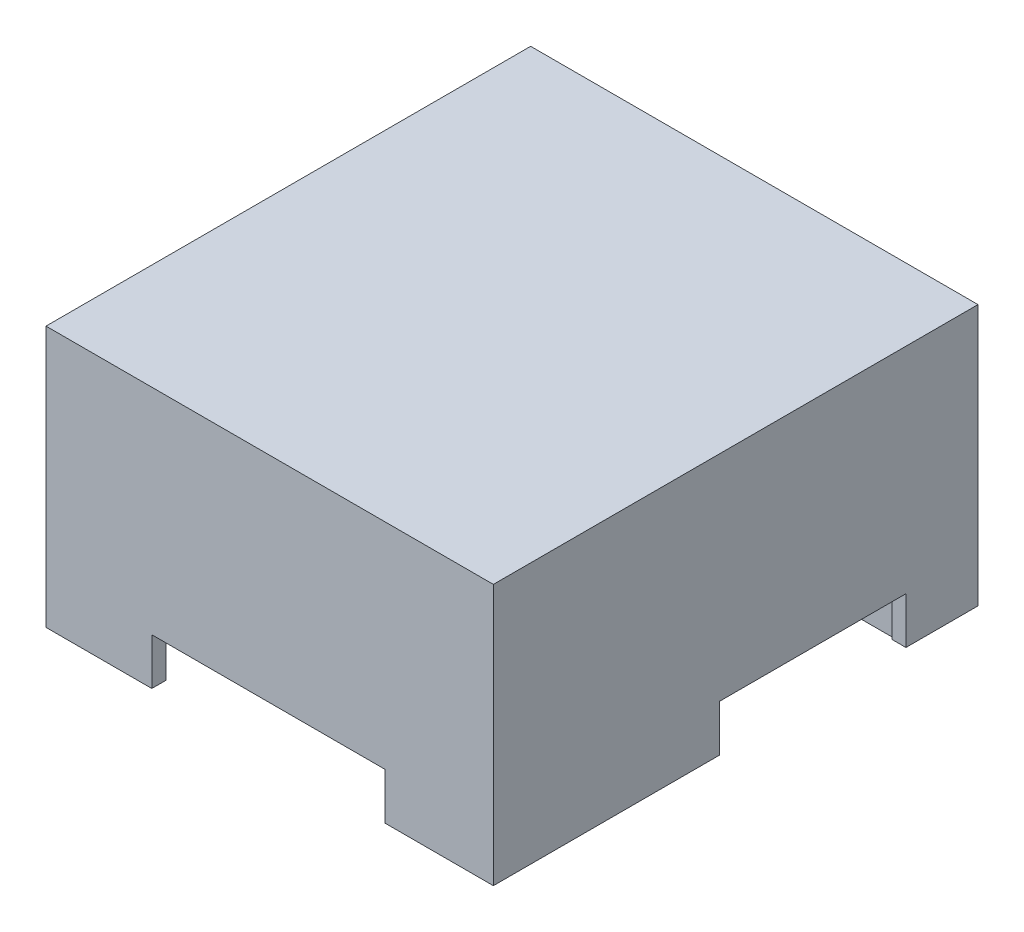
ISO-10303-21;
HEADER;
FILE_DESCRIPTION(('STEP AP214'),'2;1');
FILE_NAME('part.step','',(''),(''),'','','');
FILE_SCHEMA(('AUTOMOTIVE_DESIGN { 1 0 10303 214 1 1 1 1 }'));
ENDSEC;
DATA;
#1=APPLICATION_CONTEXT('core data for automotive mechanical design processes');
#2=APPLICATION_PROTOCOL_DEFINITION('international standard','automotive_design',2000,#1);
#3=PRODUCT_CONTEXT('',#1,'mechanical');
#4=PRODUCT('Part','Part','',(#3));
#5=PRODUCT_RELATED_PRODUCT_CATEGORY('part','',(#4));
#6=PRODUCT_DEFINITION_FORMATION('','',#4);
#7=PRODUCT_DEFINITION_CONTEXT('part definition',#1,'design');
#8=PRODUCT_DEFINITION('design','',#6,#7);
#9=PRODUCT_DEFINITION_SHAPE('','',#8);
#10=(LENGTH_UNIT() NAMED_UNIT(*) SI_UNIT(.MILLI.,.METRE.));
#11=(NAMED_UNIT(*) PLANE_ANGLE_UNIT() SI_UNIT($,.RADIAN.));
#12=(NAMED_UNIT(*) SI_UNIT($,.STERADIAN.) SOLID_ANGLE_UNIT());
#13=UNCERTAINTY_MEASURE_WITH_UNIT(LENGTH_MEASURE(1.E-05),#10,'distance_accuracy_value','');
#14=(GEOMETRIC_REPRESENTATION_CONTEXT(3) GLOBAL_UNCERTAINTY_ASSIGNED_CONTEXT((#13)) GLOBAL_UNIT_ASSIGNED_CONTEXT((#10,
#11,#12)) REPRESENTATION_CONTEXT('',''));
#15=CARTESIAN_POINT('',(0.,0.,0.));
#16=DIRECTION('',(0.,0.,1.));
#17=DIRECTION('',(1.,0.,0.));
#18=AXIS2_PLACEMENT_3D('',#15,#16,#17);
#19=CARTESIAN_POINT('',(0.,0.,0.));
#20=DIRECTION('',(0.,-1.,0.));
#21=DIRECTION('',(0.,0.,-1.));
#22=AXIS2_PLACEMENT_3D('',#19,#20,#21);
#23=PLANE('',#22);
#24=CARTESIAN_POINT('',(-18.75,0.,-20.6237708175574));
#25=DIRECTION('',(0.,1.,0.));
#26=DIRECTION('',(0.,0.,1.));
#27=AXIS2_PLACEMENT_3D('',#24,#25,#26);
#28=CIRCLE('',#27,1.);
#29=CARTESIAN_POINT('',(-18.75,0.,-19.6237708175574));
#30=VERTEX_POINT('',#29);
#31=EDGE_CURVE('E390',#30,#30,#28,.T.);
#32=ORIENTED_EDGE('',*,*,#31,.T.);
#33=EDGE_LOOP('',(#32));
#34=FACE_BOUND('',#33,.T.);
#35=CARTESIAN_POINT('',(18.75,0.,-20.6237708175574));
#36=DIRECTION('',(0.,1.,0.));
#37=DIRECTION('',(0.,0.,-1.));
#38=AXIS2_PLACEMENT_3D('',#35,#36,#37);
#39=CIRCLE('',#38,1.);
#40=CARTESIAN_POINT('',(18.75,0.,-21.6237708175574));
#41=VERTEX_POINT('',#40);
#42=EDGE_CURVE('E386',#41,#41,#39,.T.);
#43=ORIENTED_EDGE('',*,*,#42,.T.);
#44=EDGE_LOOP('',(#43));
#45=FACE_BOUND('',#44,.T.);
#46=DIRECTION('',(0.,0.,1.));
#47=VECTOR('',#46,1.);
#48=CARTESIAN_POINT('',(-22.5,0.,-24.5));
#49=LINE('',#48,#47);
#50=CARTESIAN_POINT('',(-22.5,0.,-18.5));
#51=VERTEX_POINT('',#50);
#52=CARTESIAN_POINT('',(-22.5,0.,-1.81575823975167));
#53=VERTEX_POINT('',#52);
#54=EDGE_CURVE('E559',#51,#53,#49,.T.);
#55=ORIENTED_EDGE('',*,*,#54,.T.);
#56=DIRECTION('',(-1.,0.,0.));
#57=VECTOR('',#56,1.);
#58=CARTESIAN_POINT('',(-21.,0.,-1.81575823975167));
#59=LINE('',#58,#57);
#60=CARTESIAN_POINT('',(-24.,0.,-1.81575823975167));
#61=VERTEX_POINT('',#60);
#62=EDGE_CURVE('E285',#53,#61,#59,.T.);
#63=ORIENTED_EDGE('',*,*,#62,.T.);
#64=DIRECTION('',(0.,0.,1.));
#65=VECTOR('',#64,1.);
#66=CARTESIAN_POINT('',(-24.,0.,-26.));
#67=LINE('',#66,#65);
#68=CARTESIAN_POINT('',(-24.,0.,-26.));
#69=VERTEX_POINT('',#68);
#70=EDGE_CURVE('E591',#69,#61,#67,.T.);
#71=ORIENTED_EDGE('',*,*,#70,.F.);
#72=DIRECTION('',(-1.,0.,0.));
#73=VECTOR('',#72,1.);
#74=CARTESIAN_POINT('',(24.,0.,-26.));
#75=LINE('',#74,#73);
#76=CARTESIAN_POINT('',(24.,0.,-26.));
#77=VERTEX_POINT('',#76);
#78=EDGE_CURVE('E604',#77,#69,#75,.T.);
#79=ORIENTED_EDGE('',*,*,#78,.F.);
#80=DIRECTION('',(0.,0.,-1.));
#81=VECTOR('',#80,1.);
#82=CARTESIAN_POINT('',(24.,0.,-26.));
#83=LINE('',#82,#81);
#84=CARTESIAN_POINT('',(24.,0.,-18.2667762256916));
#85=VERTEX_POINT('',#84);
#86=EDGE_CURVE('E599',#85,#77,#83,.T.);
#87=ORIENTED_EDGE('',*,*,#86,.F.);
#88=DIRECTION('',(1.,0.,0.));
#89=VECTOR('',#88,1.);
#90=CARTESIAN_POINT('',(21.,0.,-18.2667762256916));
#91=LINE('',#90,#89);
#92=CARTESIAN_POINT('',(22.5,0.,-18.2667762256916));
#93=VERTEX_POINT('',#92);
#94=EDGE_CURVE('E314',#93,#85,#91,.T.);
#95=ORIENTED_EDGE('',*,*,#94,.F.);
#96=DIRECTION('',(0.,0.,-1.));
#97=VECTOR('',#96,1.);
#98=CARTESIAN_POINT('',(22.5,0.,-24.5));
#99=LINE('',#98,#97);
#100=CARTESIAN_POINT('',(22.5,0.,-18.5));
#101=VERTEX_POINT('',#100);
#102=EDGE_CURVE('E568',#93,#101,#99,.T.);
#103=ORIENTED_EDGE('',*,*,#102,.T.);
#104=DIRECTION('',(1.,0.,0.));
#105=VECTOR('',#104,1.);
#106=CARTESIAN_POINT('',(22.5,0.,-18.5));
#107=LINE('',#106,#105);
#108=CARTESIAN_POINT('',(16.5,0.,-18.5));
#109=VERTEX_POINT('',#108);
#110=EDGE_CURVE('E490',#109,#101,#107,.T.);
#111=ORIENTED_EDGE('',*,*,#110,.F.);
#112=DIRECTION('',(0.,0.,1.));
#113=VECTOR('',#112,1.);
#114=CARTESIAN_POINT('',(16.5,0.,-24.5));
#115=LINE('',#114,#113);
#116=CARTESIAN_POINT('',(16.5,0.,-24.5));
#117=VERTEX_POINT('',#116);
#118=EDGE_CURVE('E494',#117,#109,#115,.T.);
#119=ORIENTED_EDGE('',*,*,#118,.F.);
#120=DIRECTION('',(-1.,0.,0.));
#121=VECTOR('',#120,1.);
#122=CARTESIAN_POINT('',(22.5,0.,-24.5));
#123=LINE('',#122,#121);
#124=CARTESIAN_POINT('',(-16.5,0.,-24.5));
#125=VERTEX_POINT('',#124);
#126=EDGE_CURVE('E546',#117,#125,#123,.T.);
#127=ORIENTED_EDGE('',*,*,#126,.T.);
#128=DIRECTION('',(0.,0.,-1.));
#129=VECTOR('',#128,1.);
#130=CARTESIAN_POINT('',(-16.5,0.,-24.5));
#131=LINE('',#130,#129);
#132=CARTESIAN_POINT('',(-16.5,0.,-18.5));
#133=VERTEX_POINT('',#132);
#134=EDGE_CURVE('E514',#133,#125,#131,.T.);
#135=ORIENTED_EDGE('',*,*,#134,.F.);
#136=DIRECTION('',(1.,0.,0.));
#137=VECTOR('',#136,1.);
#138=CARTESIAN_POINT('',(-22.5,0.,-18.5));
#139=LINE('',#138,#137);
#140=EDGE_CURVE('E498',#51,#133,#139,.T.);
#141=ORIENTED_EDGE('',*,*,#140,.F.);
#142=EDGE_LOOP('',(#55,#63,#71,#79,#87,#95,#103,#111,#119,#127,#135,#141));
#143=FACE_BOUND('',#142,.T.);
#144=ADVANCED_FACE('F45',(#34,#45,#143),#23,.T.);
#145=CARTESIAN_POINT('',(18.75,0.,20.8762291824426));
#146=DIRECTION('',(0.,1.,0.));
#147=DIRECTION('',(0.,0.,1.));
#148=AXIS2_PLACEMENT_3D('',#145,#146,#147);
#149=CIRCLE('',#148,1.);
#150=CARTESIAN_POINT('',(18.75,0.,21.8762291824426));
#151=VERTEX_POINT('',#150);
#152=EDGE_CURVE('E395',#151,#151,#149,.T.);
#153=ORIENTED_EDGE('',*,*,#152,.T.);
#154=EDGE_LOOP('',(#153));
#155=FACE_BOUND('',#154,.T.);
#156=CARTESIAN_POINT('',(22.5,0.,18.5));
#157=VERTEX_POINT('',#156);
#158=CARTESIAN_POINT('',(22.5,0.,1.73322377430841));
#159=VERTEX_POINT('',#158);
#160=EDGE_CURVE('E569',#157,#159,#99,.T.);
#161=ORIENTED_EDGE('',*,*,#160,.T.);
#162=DIRECTION('',(1.,0.,0.));
#163=VECTOR('',#162,1.);
#164=CARTESIAN_POINT('',(21.,0.,1.73322377430841));
#165=LINE('',#164,#163);
#166=CARTESIAN_POINT('',(24.,0.,1.73322377430841));
#167=VERTEX_POINT('',#166);
#168=EDGE_CURVE('E317',#159,#167,#165,.T.);
#169=ORIENTED_EDGE('',*,*,#168,.T.);
#170=CARTESIAN_POINT('',(24.,0.,26.));
#171=VERTEX_POINT('',#170);
#172=EDGE_CURVE('E600',#171,#167,#83,.T.);
#173=ORIENTED_EDGE('',*,*,#172,.F.);
#174=DIRECTION('',(1.,0.,0.));
#175=VECTOR('',#174,1.);
#176=CARTESIAN_POINT('',(24.,0.,26.));
#177=LINE('',#176,#175);
#178=CARTESIAN_POINT('',(12.3513897517003,0.,26.));
#179=VERTEX_POINT('',#178);
#180=EDGE_CURVE('E594',#179,#171,#177,.T.);
#181=ORIENTED_EDGE('',*,*,#180,.F.);
#182=DIRECTION('',(0.,0.,1.));
#183=VECTOR('',#182,1.);
#184=CARTESIAN_POINT('',(12.3513897517003,0.,23.));
#185=LINE('',#184,#183);
#186=CARTESIAN_POINT('',(12.3513897517003,0.,24.5));
#187=VERTEX_POINT('',#186);
#188=EDGE_CURVE('E352',#187,#179,#185,.T.);
#189=ORIENTED_EDGE('',*,*,#188,.F.);
#190=DIRECTION('',(1.,0.,0.));
#191=VECTOR('',#190,1.);
#192=CARTESIAN_POINT('',(22.5,0.,24.5));
#193=LINE('',#192,#191);
#194=CARTESIAN_POINT('',(16.5,0.,24.5));
#195=VERTEX_POINT('',#194);
#196=EDGE_CURVE('E563',#187,#195,#193,.T.);
#197=ORIENTED_EDGE('',*,*,#196,.T.);
#198=DIRECTION('',(0.,0.,1.));
#199=VECTOR('',#198,1.);
#200=CARTESIAN_POINT('',(16.5,0.,24.5));
#201=LINE('',#200,#199);
#202=CARTESIAN_POINT('',(16.5,0.,18.5));
#203=VERTEX_POINT('',#202);
#204=EDGE_CURVE('E460',#203,#195,#201,.T.);
#205=ORIENTED_EDGE('',*,*,#204,.F.);
#206=DIRECTION('',(-1.,0.,0.));
#207=VECTOR('',#206,1.);
#208=CARTESIAN_POINT('',(22.5,0.,18.5));
#209=LINE('',#208,#207);
#210=EDGE_CURVE('E464',#157,#203,#209,.T.);
#211=ORIENTED_EDGE('',*,*,#210,.F.);
#212=EDGE_LOOP('',(#161,#169,#173,#181,#189,#197,#205,#211));
#213=FACE_BOUND('',#212,.T.);
#214=ADVANCED_FACE('F624',(#155,#213),#23,.T.);
#215=CARTESIAN_POINT('',(22.5,25.,24.5));
#216=DIRECTION('',(0.,0.,-1.));
#217=DIRECTION('',(-1.,0.,0.));
#218=AXIS2_PLACEMENT_3D('',#215,#216,#217);
#219=PLANE('',#218);
#220=DIRECTION('',(0.,-1.,0.));
#221=VECTOR('',#220,1.);
#222=CARTESIAN_POINT('',(12.3513897517003,25.,24.5));
#223=LINE('',#222,#221);
#224=CARTESIAN_POINT('',(12.3513897517003,5.,24.5));
#225=VERTEX_POINT('',#224);
#226=EDGE_CURVE('E362',#225,#187,#223,.T.);
#227=ORIENTED_EDGE('',*,*,#226,.F.);
#228=DIRECTION('',(-1.,0.,0.));
#229=VECTOR('',#228,1.);
#230=CARTESIAN_POINT('',(22.5,5.,24.5));
#231=LINE('',#230,#229);
#232=CARTESIAN_POINT('',(-12.6486102482997,5.,24.5));
#233=VERTEX_POINT('',#232);
#234=EDGE_CURVE('E365',#225,#233,#231,.T.);
#235=ORIENTED_EDGE('',*,*,#234,.T.);
#236=DIRECTION('',(0.,-1.,0.));
#237=VECTOR('',#236,1.);
#238=CARTESIAN_POINT('',(-12.6486102482997,25.,24.5));
#239=LINE('',#238,#237);
#240=CARTESIAN_POINT('',(-12.6486102482997,0.,24.5));
#241=VERTEX_POINT('',#240);
#242=EDGE_CURVE('E358',#233,#241,#239,.T.);
#243=ORIENTED_EDGE('',*,*,#242,.T.);
#244=CARTESIAN_POINT('',(-16.5,0.,24.5));
#245=VERTEX_POINT('',#244);
#246=EDGE_CURVE('E564',#245,#241,#193,.T.);
#247=ORIENTED_EDGE('',*,*,#246,.F.);
#248=DIRECTION('',(0.,-1.,0.));
#249=VECTOR('',#248,1.);
#250=CARTESIAN_POINT('',(-16.5,15.,24.5));
#251=LINE('',#250,#249);
#252=CARTESIAN_POINT('',(-16.5,15.,24.5));
#253=VERTEX_POINT('',#252);
#254=EDGE_CURVE('E414',#253,#245,#251,.T.);
#255=ORIENTED_EDGE('',*,*,#254,.F.);
#256=DIRECTION('',(1.,0.,0.));
#257=VECTOR('',#256,1.);
#258=CARTESIAN_POINT('',(-22.5,15.,24.5));
#259=LINE('',#258,#257);
#260=CARTESIAN_POINT('',(-22.5,15.,24.5));
#261=VERTEX_POINT('',#260);
#262=EDGE_CURVE('E444',#261,#253,#259,.T.);
#263=ORIENTED_EDGE('',*,*,#262,.F.);
#264=DIRECTION('',(0.,-1.,0.));
#265=VECTOR('',#264,1.);
#266=CARTESIAN_POINT('',(-22.5,25.,24.5));
#267=LINE('',#266,#265);
#268=CARTESIAN_POINT('',(-22.5,25.,24.5));
#269=VERTEX_POINT('',#268);
#270=EDGE_CURVE('E586',#269,#261,#267,.T.);
#271=ORIENTED_EDGE('',*,*,#270,.F.);
#272=DIRECTION('',(1.,0.,0.));
#273=VECTOR('',#272,1.);
#274=CARTESIAN_POINT('',(22.5,25.,24.5));
#275=LINE('',#274,#273);
#276=CARTESIAN_POINT('',(22.5,25.,24.5));
#277=VERTEX_POINT('',#276);
#278=EDGE_CURVE('E545',#269,#277,#275,.T.);
#279=ORIENTED_EDGE('',*,*,#278,.T.);
#280=DIRECTION('',(0.,-1.,0.));
#281=VECTOR('',#280,1.);
#282=CARTESIAN_POINT('',(22.5,25.,24.5));
#283=LINE('',#282,#281);
#284=CARTESIAN_POINT('',(22.5,15.,24.5));
#285=VERTEX_POINT('',#284);
#286=EDGE_CURVE('E582',#277,#285,#283,.T.);
#287=ORIENTED_EDGE('',*,*,#286,.T.);
#288=DIRECTION('',(1.,0.,0.));
#289=VECTOR('',#288,1.);
#290=CARTESIAN_POINT('',(22.5,15.,24.5));
#291=LINE('',#290,#289);
#292=CARTESIAN_POINT('',(16.5,15.,24.5));
#293=VERTEX_POINT('',#292);
#294=EDGE_CURVE('E465',#293,#285,#291,.T.);
#295=ORIENTED_EDGE('',*,*,#294,.F.);
#296=DIRECTION('',(0.,-1.,0.));
#297=VECTOR('',#296,1.);
#298=CARTESIAN_POINT('',(16.5,15.,24.5));
#299=LINE('',#298,#297);
#300=EDGE_CURVE('E455',#293,#195,#299,.T.);
#301=ORIENTED_EDGE('',*,*,#300,.T.);
#302=ORIENTED_EDGE('',*,*,#196,.F.);
#303=EDGE_LOOP('',(#227,#235,#243,#247,#255,#263,#271,#279,#287,#295,#301,#302));
#304=FACE_BOUND('',#303,.T.);
#305=ADVANCED_FACE('F673',(#304),#219,.T.);
#306=CARTESIAN_POINT('',(-22.5,25.,-24.5));
#307=DIRECTION('',(1.,0.,0.));
#308=DIRECTION('',(0.,0.,-1.));
#309=AXIS2_PLACEMENT_3D('',#306,#307,#308);
#310=PLANE('',#309);
#311=DIRECTION('',(0.,-1.,0.));
#312=VECTOR('',#311,1.);
#313=CARTESIAN_POINT('',(-22.5,25.,18.1842417602483));
#314=LINE('',#313,#312);
#315=CARTESIAN_POINT('',(-22.5,5.,18.1842417602483));
#316=VERTEX_POINT('',#315);
#317=CARTESIAN_POINT('',(-22.5,0.,18.1842417602483));
#318=VERTEX_POINT('',#317);
#319=EDGE_CURVE('E294',#316,#318,#314,.T.);
#320=ORIENTED_EDGE('',*,*,#319,.F.);
#321=DIRECTION('',(0.,0.,-1.));
#322=VECTOR('',#321,1.);
#323=CARTESIAN_POINT('',(-22.5,5.,-24.5));
#324=LINE('',#323,#322);
#325=CARTESIAN_POINT('',(-22.5,5.,-1.81575823975167));
#326=VERTEX_POINT('',#325);
#327=EDGE_CURVE('E259',#316,#326,#324,.T.);
#328=ORIENTED_EDGE('',*,*,#327,.T.);
#329=DIRECTION('',(0.,-1.,0.));
#330=VECTOR('',#329,1.);
#331=CARTESIAN_POINT('',(-22.5,25.,-1.81575823975167));
#332=LINE('',#331,#330);
#333=EDGE_CURVE('E263',#326,#53,#332,.T.);
#334=ORIENTED_EDGE('',*,*,#333,.T.);
#335=ORIENTED_EDGE('',*,*,#54,.F.);
#336=DIRECTION('',(0.,-1.,0.));
#337=VECTOR('',#336,1.);
#338=CARTESIAN_POINT('',(-22.5,15.,-18.5));
#339=LINE('',#338,#337);
#340=CARTESIAN_POINT('',(-22.5,15.,-18.5));
#341=VERTEX_POINT('',#340);
#342=EDGE_CURVE('E536',#341,#51,#339,.T.);
#343=ORIENTED_EDGE('',*,*,#342,.F.);
#344=DIRECTION('',(0.,0.,1.));
#345=VECTOR('',#344,1.);
#346=CARTESIAN_POINT('',(-22.5,15.,-24.5));
#347=LINE('',#346,#345);
#348=CARTESIAN_POINT('',(-22.5,15.,-24.5));
#349=VERTEX_POINT('',#348);
#350=EDGE_CURVE('E509',#349,#341,#347,.T.);
#351=ORIENTED_EDGE('',*,*,#350,.F.);
#352=DIRECTION('',(0.,-1.,0.));
#353=VECTOR('',#352,1.);
#354=CARTESIAN_POINT('',(-22.5,25.,-24.5));
#355=LINE('',#354,#353);
#356=CARTESIAN_POINT('',(-22.5,25.,-24.5));
#357=VERTEX_POINT('',#356);
#358=EDGE_CURVE('E558',#357,#349,#355,.T.);
#359=ORIENTED_EDGE('',*,*,#358,.F.);
#360=DIRECTION('',(0.,0.,1.));
#361=VECTOR('',#360,1.);
#362=CARTESIAN_POINT('',(-22.5,25.,-24.5));
#363=LINE('',#362,#361);
#364=EDGE_CURVE('E541',#357,#269,#363,.T.);
#365=ORIENTED_EDGE('',*,*,#364,.T.);
#366=ORIENTED_EDGE('',*,*,#270,.T.);
#367=DIRECTION('',(0.,0.,1.));
#368=VECTOR('',#367,1.);
#369=CARTESIAN_POINT('',(-22.5,15.,24.5));
#370=LINE('',#369,#368);
#371=CARTESIAN_POINT('',(-22.5,15.,18.5));
#372=VERTEX_POINT('',#371);
#373=EDGE_CURVE('E435',#372,#261,#370,.T.);
#374=ORIENTED_EDGE('',*,*,#373,.F.);
#375=DIRECTION('',(0.,-1.,0.));
#376=VECTOR('',#375,1.);
#377=CARTESIAN_POINT('',(-22.5,15.,18.5));
#378=LINE('',#377,#376);
#379=CARTESIAN_POINT('',(-22.5,0.,18.5));
#380=VERTEX_POINT('',#379);
#381=EDGE_CURVE('E425',#372,#380,#378,.T.);
#382=ORIENTED_EDGE('',*,*,#381,.T.);
#383=EDGE_CURVE('E540',#318,#380,#49,.T.);
#384=ORIENTED_EDGE('',*,*,#383,.F.);
#385=EDGE_LOOP('',(#320,#328,#334,#335,#343,#351,#359,#365,#366,#374,#382,#384));
#386=FACE_BOUND('',#385,.T.);
#387=ADVANCED_FACE('F664',(#386),#310,.T.);
#388=CARTESIAN_POINT('',(22.5,25.,-24.5));
#389=DIRECTION('',(-1.,0.,0.));
#390=DIRECTION('',(0.,0.,1.));
#391=AXIS2_PLACEMENT_3D('',#388,#389,#390);
#392=PLANE('',#391);
#393=DIRECTION('',(0.,-1.,0.));
#394=VECTOR('',#393,1.);
#395=CARTESIAN_POINT('',(22.5,25.,-18.2667762256916));
#396=LINE('',#395,#394);
#397=CARTESIAN_POINT('',(22.5,5.,-18.2667762256916));
#398=VERTEX_POINT('',#397);
#399=EDGE_CURVE('E326',#398,#93,#396,.T.);
#400=ORIENTED_EDGE('',*,*,#399,.F.);
#401=DIRECTION('',(0.,0.,-1.));
#402=VECTOR('',#401,1.);
#403=CARTESIAN_POINT('',(22.5,5.,-24.5));
#404=LINE('',#403,#402);
#405=CARTESIAN_POINT('',(22.5,5.,1.73322377430841));
#406=VERTEX_POINT('',#405);
#407=EDGE_CURVE('E329',#406,#398,#404,.T.);
#408=ORIENTED_EDGE('',*,*,#407,.F.);
#409=DIRECTION('',(0.,-1.,0.));
#410=VECTOR('',#409,1.);
#411=CARTESIAN_POINT('',(22.5,25.,1.73322377430841));
#412=LINE('',#411,#410);
#413=EDGE_CURVE('E313',#406,#159,#412,.T.);
#414=ORIENTED_EDGE('',*,*,#413,.T.);
#415=ORIENTED_EDGE('',*,*,#160,.F.);
#416=DIRECTION('',(0.,-1.,0.));
#417=VECTOR('',#416,1.);
#418=CARTESIAN_POINT('',(22.5,15.,18.5));
#419=LINE('',#418,#417);
#420=CARTESIAN_POINT('',(22.5,15.,18.5));
#421=VERTEX_POINT('',#420);
#422=EDGE_CURVE('E438',#421,#157,#419,.T.);
#423=ORIENTED_EDGE('',*,*,#422,.F.);
#424=DIRECTION('',(0.,0.,-1.));
#425=VECTOR('',#424,1.);
#426=CARTESIAN_POINT('',(22.5,15.,24.5));
#427=LINE('',#426,#425);
#428=EDGE_CURVE('E474',#285,#421,#427,.T.);
#429=ORIENTED_EDGE('',*,*,#428,.F.);
#430=ORIENTED_EDGE('',*,*,#286,.F.);
#431=DIRECTION('',(0.,0.,-1.));
#432=VECTOR('',#431,1.);
#433=CARTESIAN_POINT('',(22.5,25.,-24.5));
#434=LINE('',#433,#432);
#435=CARTESIAN_POINT('',(22.5,25.,-24.5));
#436=VERTEX_POINT('',#435);
#437=EDGE_CURVE('E550',#277,#436,#434,.T.);
#438=ORIENTED_EDGE('',*,*,#437,.T.);
#439=DIRECTION('',(0.,-1.,0.));
#440=VECTOR('',#439,1.);
#441=CARTESIAN_POINT('',(22.5,25.,-24.5));
#442=LINE('',#441,#440);
#443=CARTESIAN_POINT('',(22.5,15.,-24.5));
#444=VERTEX_POINT('',#443);
#445=EDGE_CURVE('E578',#436,#444,#442,.T.);
#446=ORIENTED_EDGE('',*,*,#445,.T.);
#447=DIRECTION('',(0.,0.,-1.));
#448=VECTOR('',#447,1.);
#449=CARTESIAN_POINT('',(22.5,15.,-24.5));
#450=LINE('',#449,#448);
#451=CARTESIAN_POINT('',(22.5,15.,-18.5));
#452=VERTEX_POINT('',#451);
#453=EDGE_CURVE('E495',#452,#444,#450,.T.);
#454=ORIENTED_EDGE('',*,*,#453,.F.);
#455=DIRECTION('',(0.,-1.,0.));
#456=VECTOR('',#455,1.);
#457=CARTESIAN_POINT('',(22.5,15.,-18.5));
#458=LINE('',#457,#456);
#459=EDGE_CURVE('E485',#452,#101,#458,.T.);
#460=ORIENTED_EDGE('',*,*,#459,.T.);
#461=ORIENTED_EDGE('',*,*,#102,.F.);
#462=EDGE_LOOP('',(#400,#408,#414,#415,#423,#429,#430,#438,#446,#454,#460,#461));
#463=FACE_BOUND('',#462,.T.);
#464=ADVANCED_FACE('F633',(#463),#392,.T.);
#465=CARTESIAN_POINT('',(22.5,25.,-24.5));
#466=DIRECTION('',(0.,0.,1.));
#467=DIRECTION('',(1.,0.,0.));
#468=AXIS2_PLACEMENT_3D('',#465,#466,#467);
#469=PLANE('',#468);
#470=ORIENTED_EDGE('',*,*,#126,.F.);
#471=DIRECTION('',(0.,-1.,0.));
#472=VECTOR('',#471,1.);
#473=CARTESIAN_POINT('',(16.5,15.,-24.5));
#474=LINE('',#473,#472);
#475=CARTESIAN_POINT('',(16.5,15.,-24.5));
#476=VERTEX_POINT('',#475);
#477=EDGE_CURVE('E468',#476,#117,#474,.T.);
#478=ORIENTED_EDGE('',*,*,#477,.F.);
#479=DIRECTION('',(-1.,0.,0.));
#480=VECTOR('',#479,1.);
#481=CARTESIAN_POINT('',(22.5,15.,-24.5));
#482=LINE('',#481,#480);
#483=EDGE_CURVE('E504',#444,#476,#482,.T.);
#484=ORIENTED_EDGE('',*,*,#483,.F.);
#485=ORIENTED_EDGE('',*,*,#445,.F.);
#486=DIRECTION('',(-1.,0.,0.));
#487=VECTOR('',#486,1.);
#488=CARTESIAN_POINT('',(22.5,25.,-24.5));
#489=LINE('',#488,#487);
#490=EDGE_CURVE('E554',#436,#357,#489,.T.);
#491=ORIENTED_EDGE('',*,*,#490,.T.);
#492=ORIENTED_EDGE('',*,*,#358,.T.);
#493=DIRECTION('',(-1.,0.,0.));
#494=VECTOR('',#493,1.);
#495=CARTESIAN_POINT('',(-22.5,15.,-24.5));
#496=LINE('',#495,#494);
#497=CARTESIAN_POINT('',(-16.5,15.,-24.5));
#498=VERTEX_POINT('',#497);
#499=EDGE_CURVE('E520',#498,#349,#496,.T.);
#500=ORIENTED_EDGE('',*,*,#499,.F.);
#501=DIRECTION('',(0.,-1.,0.));
#502=VECTOR('',#501,1.);
#503=CARTESIAN_POINT('',(-16.5,15.,-24.5));
#504=LINE('',#503,#502);
#505=EDGE_CURVE('E523',#498,#125,#504,.T.);
#506=ORIENTED_EDGE('',*,*,#505,.T.);
#507=EDGE_LOOP('',(#470,#478,#484,#485,#491,#492,#500,#506));
#508=FACE_BOUND('',#507,.T.);
#509=ADVANCED_FACE('F711',(#508),#469,.T.);
#510=DIRECTION('',(-1.,0.,0.));
#511=VECTOR('',#510,1.);
#512=CARTESIAN_POINT('',(-21.,0.,18.1842417602483));
#513=LINE('',#512,#511);
#514=CARTESIAN_POINT('',(-24.,0.,18.1842417602483));
#515=VERTEX_POINT('',#514);
#516=EDGE_CURVE('E264',#318,#515,#513,.T.);
#517=ORIENTED_EDGE('',*,*,#516,.F.);
#518=ORIENTED_EDGE('',*,*,#383,.T.);
#519=DIRECTION('',(-1.,0.,0.));
#520=VECTOR('',#519,1.);
#521=CARTESIAN_POINT('',(-22.5,0.,18.5));
#522=LINE('',#521,#520);
#523=CARTESIAN_POINT('',(-16.5,0.,18.5));
#524=VERTEX_POINT('',#523);
#525=EDGE_CURVE('E430',#524,#380,#522,.T.);
#526=ORIENTED_EDGE('',*,*,#525,.F.);
#527=DIRECTION('',(0.,0.,-1.));
#528=VECTOR('',#527,1.);
#529=CARTESIAN_POINT('',(-16.5,0.,24.5));
#530=LINE('',#529,#528);
#531=EDGE_CURVE('E434',#245,#524,#530,.T.);
#532=ORIENTED_EDGE('',*,*,#531,.F.);
#533=ORIENTED_EDGE('',*,*,#246,.T.);
#534=DIRECTION('',(0.,0.,1.));
#535=VECTOR('',#534,1.);
#536=CARTESIAN_POINT('',(-12.6486102482997,0.,23.));
#537=LINE('',#536,#535);
#538=CARTESIAN_POINT('',(-12.6486102482997,0.,26.));
#539=VERTEX_POINT('',#538);
#540=EDGE_CURVE('E348',#241,#539,#537,.T.);
#541=ORIENTED_EDGE('',*,*,#540,.T.);
#542=CARTESIAN_POINT('',(-24.,0.,26.));
#543=VERTEX_POINT('',#542);
#544=EDGE_CURVE('E595',#543,#539,#177,.T.);
#545=ORIENTED_EDGE('',*,*,#544,.F.);
#546=EDGE_CURVE('E590',#515,#543,#67,.T.);
#547=ORIENTED_EDGE('',*,*,#546,.F.);
#548=EDGE_LOOP('',(#517,#518,#526,#532,#533,#541,#545,#547));
#549=FACE_BOUND('',#548,.T.);
#550=CARTESIAN_POINT('',(-18.75,0.,20.8762291824426));
#551=DIRECTION('',(0.,1.,0.));
#552=DIRECTION('',(0.,0.,-1.));
#553=AXIS2_PLACEMENT_3D('',#550,#551,#552);
#554=CIRCLE('',#553,1.);
#555=CARTESIAN_POINT('',(-18.75,0.,19.8762291824426));
#556=VERTEX_POINT('',#555);
#557=EDGE_CURVE('E403',#556,#556,#554,.T.);
#558=ORIENTED_EDGE('',*,*,#557,.T.);
#559=EDGE_LOOP('',(#558));
#560=FACE_BOUND('',#559,.T.);
#561=ADVANCED_FACE('F655',(#549,#560),#23,.T.);
#562=CARTESIAN_POINT('',(-24.,25.,-26.));
#563=DIRECTION('',(1.,0.,0.));
#564=DIRECTION('',(0.,0.,-1.));
#565=AXIS2_PLACEMENT_3D('',#562,#563,#564);
#566=PLANE('',#565);
#567=DIRECTION('',(0.,0.,1.));
#568=VECTOR('',#567,1.);
#569=CARTESIAN_POINT('',(-24.,5.,-1.81575823975167));
#570=LINE('',#569,#568);
#571=CARTESIAN_POINT('',(-24.,5.,-1.81575823975167));
#572=VERTEX_POINT('',#571);
#573=CARTESIAN_POINT('',(-24.,5.,18.1842417602483));
#574=VERTEX_POINT('',#573);
#575=EDGE_CURVE('E61',#572,#574,#570,.T.);
#576=ORIENTED_EDGE('',*,*,#575,.T.);
#577=DIRECTION('',(0.,1.,0.));
#578=VECTOR('',#577,1.);
#579=CARTESIAN_POINT('',(-24.,0.,18.1842417602483));
#580=LINE('',#579,#578);
#581=EDGE_CURVE('E267',#515,#574,#580,.T.);
#582=ORIENTED_EDGE('',*,*,#581,.F.);
#583=ORIENTED_EDGE('',*,*,#546,.T.);
#584=DIRECTION('',(0.,-1.,0.));
#585=VECTOR('',#584,1.);
#586=CARTESIAN_POINT('',(-24.,25.,26.));
#587=LINE('',#586,#585);
#588=CARTESIAN_POINT('',(-24.,28.,26.));
#589=VERTEX_POINT('',#588);
#590=EDGE_CURVE('E11',#589,#543,#587,.T.);
#591=ORIENTED_EDGE('',*,*,#590,.F.);
#592=DIRECTION('',(0.,0.,1.));
#593=VECTOR('',#592,1.);
#594=CARTESIAN_POINT('',(-24.,28.,-26.));
#595=LINE('',#594,#593);
#596=CARTESIAN_POINT('',(-24.,28.,-26.));
#597=VERTEX_POINT('',#596);
#598=EDGE_CURVE('E369',#597,#589,#595,.T.);
#599=ORIENTED_EDGE('',*,*,#598,.F.);
#600=DIRECTION('',(0.,-1.,0.));
#601=VECTOR('',#600,1.);
#602=CARTESIAN_POINT('',(-24.,25.,-26.));
#603=LINE('',#602,#601);
#604=EDGE_CURVE('E607',#597,#69,#603,.T.);
#605=ORIENTED_EDGE('',*,*,#604,.T.);
#606=ORIENTED_EDGE('',*,*,#70,.T.);
#607=DIRECTION('',(0.,1.,0.));
#608=VECTOR('',#607,1.);
#609=CARTESIAN_POINT('',(-24.,0.,-1.81575823975167));
#610=LINE('',#609,#608);
#611=EDGE_CURVE('E273',#61,#572,#610,.T.);
#612=ORIENTED_EDGE('',*,*,#611,.T.);
#613=EDGE_LOOP('',(#576,#582,#583,#591,#599,#605,#606,#612));
#614=FACE_BOUND('',#613,.T.);
#615=ADVANCED_FACE('F47',(#614),#566,.F.);
#616=CARTESIAN_POINT('',(24.,25.,26.));
#617=DIRECTION('',(0.,0.,-1.));
#618=DIRECTION('',(-1.,0.,0.));
#619=AXIS2_PLACEMENT_3D('',#616,#617,#618);
#620=PLANE('',#619);
#621=DIRECTION('',(1.,0.,0.));
#622=VECTOR('',#621,1.);
#623=CARTESIAN_POINT('',(-12.6486102482997,5.,26.));
#624=LINE('',#623,#622);
#625=CARTESIAN_POINT('',(-12.6486102482997,5.,26.));
#626=VERTEX_POINT('',#625);
#627=CARTESIAN_POINT('',(12.3513897517003,5.,26.));
#628=VERTEX_POINT('',#627);
#629=EDGE_CURVE('E332',#626,#628,#624,.T.);
#630=ORIENTED_EDGE('',*,*,#629,.T.);
#631=DIRECTION('',(0.,1.,0.));
#632=VECTOR('',#631,1.);
#633=CARTESIAN_POINT('',(12.3513897517003,0.,26.));
#634=LINE('',#633,#632);
#635=EDGE_CURVE('E336',#179,#628,#634,.T.);
#636=ORIENTED_EDGE('',*,*,#635,.F.);
#637=ORIENTED_EDGE('',*,*,#180,.T.);
#638=DIRECTION('',(0.,-1.,0.));
#639=VECTOR('',#638,1.);
#640=CARTESIAN_POINT('',(24.,25.,26.));
#641=LINE('',#640,#639);
#642=CARTESIAN_POINT('',(24.,28.,26.));
#643=VERTEX_POINT('',#642);
#644=EDGE_CURVE('E54',#643,#171,#641,.T.);
#645=ORIENTED_EDGE('',*,*,#644,.F.);
#646=DIRECTION('',(1.,0.,0.));
#647=VECTOR('',#646,1.);
#648=CARTESIAN_POINT('',(-24.,28.,26.));
#649=LINE('',#648,#647);
#650=EDGE_CURVE('E373',#589,#643,#649,.T.);
#651=ORIENTED_EDGE('',*,*,#650,.F.);
#652=ORIENTED_EDGE('',*,*,#590,.T.);
#653=ORIENTED_EDGE('',*,*,#544,.T.);
#654=DIRECTION('',(0.,1.,0.));
#655=VECTOR('',#654,1.);
#656=CARTESIAN_POINT('',(-12.6486102482997,0.,26.));
#657=LINE('',#656,#655);
#658=EDGE_CURVE('E340',#539,#626,#657,.T.);
#659=ORIENTED_EDGE('',*,*,#658,.T.);
#660=EDGE_LOOP('',(#630,#636,#637,#645,#651,#652,#653,#659));
#661=FACE_BOUND('',#660,.T.);
#662=ADVANCED_FACE('F679',(#661),#620,.F.);
#663=CARTESIAN_POINT('',(24.,25.,-26.));
#664=DIRECTION('',(-1.,0.,0.));
#665=DIRECTION('',(0.,0.,1.));
#666=AXIS2_PLACEMENT_3D('',#663,#664,#665);
#667=PLANE('',#666);
#668=DIRECTION('',(0.,0.,1.));
#669=VECTOR('',#668,1.);
#670=CARTESIAN_POINT('',(24.,5.,-18.2667762256916));
#671=LINE('',#670,#669);
#672=CARTESIAN_POINT('',(24.,5.,-18.2667762256916));
#673=VERTEX_POINT('',#672);
#674=CARTESIAN_POINT('',(24.,5.,1.73322377430841));
#675=VERTEX_POINT('',#674);
#676=EDGE_CURVE('E69',#673,#675,#671,.T.);
#677=ORIENTED_EDGE('',*,*,#676,.F.);
#678=DIRECTION('',(0.,1.,0.));
#679=VECTOR('',#678,1.);
#680=CARTESIAN_POINT('',(24.,0.,-18.2667762256916));
#681=LINE('',#680,#679);
#682=EDGE_CURVE('E305',#85,#673,#681,.T.);
#683=ORIENTED_EDGE('',*,*,#682,.F.);
#684=ORIENTED_EDGE('',*,*,#86,.T.);
#685=DIRECTION('',(0.,-1.,0.));
#686=VECTOR('',#685,1.);
#687=CARTESIAN_POINT('',(24.,25.,-26.));
#688=LINE('',#687,#686);
#689=CARTESIAN_POINT('',(24.,28.,-26.));
#690=VERTEX_POINT('',#689);
#691=EDGE_CURVE('E611',#690,#77,#688,.T.);
#692=ORIENTED_EDGE('',*,*,#691,.F.);
#693=DIRECTION('',(0.,0.,-1.));
#694=VECTOR('',#693,1.);
#695=CARTESIAN_POINT('',(24.,28.,-26.));
#696=LINE('',#695,#694);
#697=EDGE_CURVE('E377',#643,#690,#696,.T.);
#698=ORIENTED_EDGE('',*,*,#697,.F.);
#699=ORIENTED_EDGE('',*,*,#644,.T.);
#700=ORIENTED_EDGE('',*,*,#172,.T.);
#701=DIRECTION('',(0.,1.,0.));
#702=VECTOR('',#701,1.);
#703=CARTESIAN_POINT('',(24.,0.,1.73322377430841));
#704=LINE('',#703,#702);
#705=EDGE_CURVE('E301',#167,#675,#704,.T.);
#706=ORIENTED_EDGE('',*,*,#705,.T.);
#707=EDGE_LOOP('',(#677,#683,#684,#692,#698,#699,#700,#706));
#708=FACE_BOUND('',#707,.T.);
#709=ADVANCED_FACE('F619',(#708),#667,.F.);
#710=CARTESIAN_POINT('',(24.,25.,-26.));
#711=DIRECTION('',(0.,0.,1.));
#712=DIRECTION('',(1.,0.,0.));
#713=AXIS2_PLACEMENT_3D('',#710,#711,#712);
#714=PLANE('',#713);
#715=ORIENTED_EDGE('',*,*,#78,.T.);
#716=ORIENTED_EDGE('',*,*,#604,.F.);
#717=DIRECTION('',(-1.,0.,0.));
#718=VECTOR('',#717,1.);
#719=CARTESIAN_POINT('',(-24.,28.,-26.));
#720=LINE('',#719,#718);
#721=EDGE_CURVE('E381',#690,#597,#720,.T.);
#722=ORIENTED_EDGE('',*,*,#721,.F.);
#723=ORIENTED_EDGE('',*,*,#691,.T.);
#724=EDGE_LOOP('',(#715,#716,#722,#723));
#725=FACE_BOUND('',#724,.T.);
#726=ADVANCED_FACE('F685',(#725),#714,.F.);
#727=CARTESIAN_POINT('',(-22.5,15.,-18.5));
#728=DIRECTION('',(0.,0.,-1.));
#729=DIRECTION('',(-1.,0.,0.));
#730=AXIS2_PLACEMENT_3D('',#727,#728,#729);
#731=PLANE('',#730);
#732=ORIENTED_EDGE('',*,*,#140,.T.);
#733=DIRECTION('',(0.,-1.,0.));
#734=VECTOR('',#733,1.);
#735=CARTESIAN_POINT('',(-16.5,15.,-18.5));
#736=LINE('',#735,#734);
#737=CARTESIAN_POINT('',(-16.5,15.,-18.5));
#738=VERTEX_POINT('',#737);
#739=EDGE_CURVE('E532',#738,#133,#736,.T.);
#740=ORIENTED_EDGE('',*,*,#739,.F.);
#741=DIRECTION('',(1.,0.,0.));
#742=VECTOR('',#741,1.);
#743=CARTESIAN_POINT('',(-22.5,15.,-18.5));
#744=LINE('',#743,#742);
#745=EDGE_CURVE('E513',#341,#738,#744,.T.);
#746=ORIENTED_EDGE('',*,*,#745,.F.);
#747=ORIENTED_EDGE('',*,*,#342,.T.);
#748=EDGE_LOOP('',(#732,#740,#746,#747));
#749=FACE_BOUND('',#748,.T.);
#750=ADVANCED_FACE('F687',(#749),#731,.F.);
#751=CARTESIAN_POINT('',(-16.5,15.,-24.5));
#752=DIRECTION('',(-1.,0.,0.));
#753=DIRECTION('',(0.,0.,1.));
#754=AXIS2_PLACEMENT_3D('',#751,#752,#753);
#755=PLANE('',#754);
#756=ORIENTED_EDGE('',*,*,#134,.T.);
#757=ORIENTED_EDGE('',*,*,#505,.F.);
#758=DIRECTION('',(0.,0.,-1.));
#759=VECTOR('',#758,1.);
#760=CARTESIAN_POINT('',(-16.5,15.,-24.5));
#761=LINE('',#760,#759);
#762=EDGE_CURVE('E517',#738,#498,#761,.T.);
#763=ORIENTED_EDGE('',*,*,#762,.F.);
#764=ORIENTED_EDGE('',*,*,#739,.T.);
#765=EDGE_LOOP('',(#756,#757,#763,#764));
#766=FACE_BOUND('',#765,.T.);
#767=ADVANCED_FACE('F694',(#766),#755,.F.);
#768=CARTESIAN_POINT('',(0.,15.,0.));
#769=DIRECTION('',(0.,1.,0.));
#770=DIRECTION('',(0.,0.,1.));
#771=AXIS2_PLACEMENT_3D('',#768,#769,#770);
#772=PLANE('',#771);
#773=ORIENTED_EDGE('',*,*,#350,.T.);
#774=ORIENTED_EDGE('',*,*,#745,.T.);
#775=ORIENTED_EDGE('',*,*,#762,.T.);
#776=ORIENTED_EDGE('',*,*,#499,.T.);
#777=EDGE_LOOP('',(#773,#774,#775,#776));
#778=FACE_BOUND('',#777,.T.);
#779=ADVANCED_FACE('F772',(#778),#772,.T.);
#780=CARTESIAN_POINT('',(16.5,15.,-24.5));
#781=DIRECTION('',(1.,0.,0.));
#782=DIRECTION('',(0.,0.,-1.));
#783=AXIS2_PLACEMENT_3D('',#780,#781,#782);
#784=PLANE('',#783);
#785=ORIENTED_EDGE('',*,*,#118,.T.);
#786=DIRECTION('',(0.,-1.,0.));
#787=VECTOR('',#786,1.);
#788=CARTESIAN_POINT('',(16.5,15.,-18.5));
#789=LINE('',#788,#787);
#790=CARTESIAN_POINT('',(16.5,15.,-18.5));
#791=VERTEX_POINT('',#790);
#792=EDGE_CURVE('E481',#791,#109,#789,.T.);
#793=ORIENTED_EDGE('',*,*,#792,.F.);
#794=DIRECTION('',(0.,0.,1.));
#795=VECTOR('',#794,1.);
#796=CARTESIAN_POINT('',(16.5,15.,-24.5));
#797=LINE('',#796,#795);
#798=EDGE_CURVE('E501',#476,#791,#797,.T.);
#799=ORIENTED_EDGE('',*,*,#798,.F.);
#800=ORIENTED_EDGE('',*,*,#477,.T.);
#801=EDGE_LOOP('',(#785,#793,#799,#800));
#802=FACE_BOUND('',#801,.T.);
#803=ADVANCED_FACE('F781',(#802),#784,.F.);
#804=CARTESIAN_POINT('',(22.5,15.,-18.5));
#805=DIRECTION('',(0.,0.,-1.));
#806=DIRECTION('',(-1.,0.,0.));
#807=AXIS2_PLACEMENT_3D('',#804,#805,#806);
#808=PLANE('',#807);
#809=ORIENTED_EDGE('',*,*,#110,.T.);
#810=ORIENTED_EDGE('',*,*,#459,.F.);
#811=DIRECTION('',(1.,0.,0.));
#812=VECTOR('',#811,1.);
#813=CARTESIAN_POINT('',(22.5,15.,-18.5));
#814=LINE('',#813,#812);
#815=EDGE_CURVE('E489',#791,#452,#814,.T.);
#816=ORIENTED_EDGE('',*,*,#815,.F.);
#817=ORIENTED_EDGE('',*,*,#792,.T.);
#818=EDGE_LOOP('',(#809,#810,#816,#817));
#819=FACE_BOUND('',#818,.T.);
#820=ADVANCED_FACE('F791',(#819),#808,.F.);
#821=CARTESIAN_POINT('',(0.,15.,0.));
#822=DIRECTION('',(0.,-1.,0.));
#823=DIRECTION('',(0.,0.,-1.));
#824=AXIS2_PLACEMENT_3D('',#821,#822,#823);
#825=PLANE('',#824);
#826=ORIENTED_EDGE('',*,*,#453,.T.);
#827=ORIENTED_EDGE('',*,*,#483,.T.);
#828=ORIENTED_EDGE('',*,*,#798,.T.);
#829=ORIENTED_EDGE('',*,*,#815,.T.);
#830=EDGE_LOOP('',(#826,#827,#828,#829));
#831=FACE_BOUND('',#830,.T.);
#832=ADVANCED_FACE('F801',(#831),#825,.F.);
#833=CARTESIAN_POINT('',(22.5,15.,18.5));
#834=DIRECTION('',(0.,0.,1.));
#835=DIRECTION('',(1.,0.,0.));
#836=AXIS2_PLACEMENT_3D('',#833,#834,#835);
#837=PLANE('',#836);
#838=ORIENTED_EDGE('',*,*,#210,.T.);
#839=DIRECTION('',(0.,-1.,0.));
#840=VECTOR('',#839,1.);
#841=CARTESIAN_POINT('',(16.5,15.,18.5));
#842=LINE('',#841,#840);
#843=CARTESIAN_POINT('',(16.5,15.,18.5));
#844=VERTEX_POINT('',#843);
#845=EDGE_CURVE('E451',#844,#203,#842,.T.);
#846=ORIENTED_EDGE('',*,*,#845,.F.);
#847=DIRECTION('',(-1.,0.,0.));
#848=VECTOR('',#847,1.);
#849=CARTESIAN_POINT('',(22.5,15.,18.5));
#850=LINE('',#849,#848);
#851=EDGE_CURVE('E471',#421,#844,#850,.T.);
#852=ORIENTED_EDGE('',*,*,#851,.F.);
#853=ORIENTED_EDGE('',*,*,#422,.T.);
#854=EDGE_LOOP('',(#838,#846,#852,#853));
#855=FACE_BOUND('',#854,.T.);
#856=ADVANCED_FACE('F811',(#855),#837,.F.);
#857=CARTESIAN_POINT('',(16.5,15.,24.5));
#858=DIRECTION('',(1.,0.,0.));
#859=DIRECTION('',(0.,0.,-1.));
#860=AXIS2_PLACEMENT_3D('',#857,#858,#859);
#861=PLANE('',#860);
#862=ORIENTED_EDGE('',*,*,#204,.T.);
#863=ORIENTED_EDGE('',*,*,#300,.F.);
#864=DIRECTION('',(0.,0.,1.));
#865=VECTOR('',#864,1.);
#866=CARTESIAN_POINT('',(16.5,15.,24.5));
#867=LINE('',#866,#865);
#868=EDGE_CURVE('E459',#844,#293,#867,.T.);
#869=ORIENTED_EDGE('',*,*,#868,.F.);
#870=ORIENTED_EDGE('',*,*,#845,.T.);
#871=EDGE_LOOP('',(#862,#863,#869,#870));
#872=FACE_BOUND('',#871,.T.);
#873=ADVANCED_FACE('F821',(#872),#861,.F.);
#874=CARTESIAN_POINT('',(0.,15.,0.));
#875=DIRECTION('',(0.,-1.,0.));
#876=DIRECTION('',(0.,0.,-1.));
#877=AXIS2_PLACEMENT_3D('',#874,#875,#876);
#878=PLANE('',#877);
#879=ORIENTED_EDGE('',*,*,#294,.T.);
#880=ORIENTED_EDGE('',*,*,#428,.T.);
#881=ORIENTED_EDGE('',*,*,#851,.T.);
#882=ORIENTED_EDGE('',*,*,#868,.T.);
#883=EDGE_LOOP('',(#879,#880,#881,#882));
#884=FACE_BOUND('',#883,.T.);
#885=ADVANCED_FACE('F831',(#884),#878,.F.);
#886=CARTESIAN_POINT('',(-16.5,15.,24.5));
#887=DIRECTION('',(-1.,0.,0.));
#888=DIRECTION('',(0.,0.,1.));
#889=AXIS2_PLACEMENT_3D('',#886,#887,#888);
#890=PLANE('',#889);
#891=ORIENTED_EDGE('',*,*,#531,.T.);
#892=DIRECTION('',(0.,-1.,0.));
#893=VECTOR('',#892,1.);
#894=CARTESIAN_POINT('',(-16.5,15.,18.5));
#895=LINE('',#894,#893);
#896=CARTESIAN_POINT('',(-16.5,15.,18.5));
#897=VERTEX_POINT('',#896);
#898=EDGE_CURVE('E421',#897,#524,#895,.T.);
#899=ORIENTED_EDGE('',*,*,#898,.F.);
#900=DIRECTION('',(0.,0.,-1.));
#901=VECTOR('',#900,1.);
#902=CARTESIAN_POINT('',(-16.5,15.,24.5));
#903=LINE('',#902,#901);
#904=EDGE_CURVE('E441',#253,#897,#903,.T.);
#905=ORIENTED_EDGE('',*,*,#904,.F.);
#906=ORIENTED_EDGE('',*,*,#254,.T.);
#907=EDGE_LOOP('',(#891,#899,#905,#906));
#908=FACE_BOUND('',#907,.T.);
#909=ADVANCED_FACE('F676',(#908),#890,.F.);
#910=CARTESIAN_POINT('',(-22.5,15.,18.5));
#911=DIRECTION('',(0.,0.,1.));
#912=DIRECTION('',(1.,0.,0.));
#913=AXIS2_PLACEMENT_3D('',#910,#911,#912);
#914=PLANE('',#913);
#915=ORIENTED_EDGE('',*,*,#525,.T.);
#916=ORIENTED_EDGE('',*,*,#381,.F.);
#917=DIRECTION('',(-1.,0.,0.));
#918=VECTOR('',#917,1.);
#919=CARTESIAN_POINT('',(-22.5,15.,18.5));
#920=LINE('',#919,#918);
#921=EDGE_CURVE('E429',#897,#372,#920,.T.);
#922=ORIENTED_EDGE('',*,*,#921,.F.);
#923=ORIENTED_EDGE('',*,*,#898,.T.);
#924=EDGE_LOOP('',(#915,#916,#922,#923));
#925=FACE_BOUND('',#924,.T.);
#926=ADVANCED_FACE('F660',(#925),#914,.F.);
#927=CARTESIAN_POINT('',(0.,15.,0.));
#928=DIRECTION('',(0.,-1.,0.));
#929=DIRECTION('',(0.,0.,-1.));
#930=AXIS2_PLACEMENT_3D('',#927,#928,#929);
#931=PLANE('',#930);
#932=ORIENTED_EDGE('',*,*,#373,.T.);
#933=ORIENTED_EDGE('',*,*,#262,.T.);
#934=ORIENTED_EDGE('',*,*,#904,.T.);
#935=ORIENTED_EDGE('',*,*,#921,.T.);
#936=EDGE_LOOP('',(#932,#933,#934,#935));
#937=FACE_BOUND('',#936,.T.);
#938=ADVANCED_FACE('F668',(#937),#931,.F.);
#939=CARTESIAN_POINT('',(-18.75,10.,-20.6237708175574));
#940=DIRECTION('',(0.,-1.,0.));
#941=DIRECTION('',(0.,0.,-1.));
#942=AXIS2_PLACEMENT_3D('',#939,#940,#941);
#943=CYLINDRICAL_SURFACE('',#942,1.);
#944=CARTESIAN_POINT('',(-18.75,10.,-20.6237708175574));
#945=DIRECTION('',(0.,1.,0.));
#946=DIRECTION('',(0.,0.,1.));
#947=AXIS2_PLACEMENT_3D('',#944,#945,#946);
#948=CIRCLE('',#947,1.);
#949=CARTESIAN_POINT('',(-18.75,10.,-19.6237708175574));
#950=VERTEX_POINT('',#949);
#951=EDGE_CURVE('E410',#950,#950,#948,.T.);
#952=ORIENTED_EDGE('',*,*,#951,.T.);
#953=EDGE_LOOP('',(#952));
#954=FACE_BOUND('',#953,.T.);
#955=ORIENTED_EDGE('',*,*,#31,.F.);
#956=EDGE_LOOP('',(#955));
#957=FACE_BOUND('',#956,.T.);
#958=ADVANCED_FACE('F866',(#954,#957),#943,.F.);
#959=CARTESIAN_POINT('',(-18.75,10.,-20.6237708175574));
#960=DIRECTION('',(0.,1.,0.));
#961=DIRECTION('',(0.,0.,1.));
#962=AXIS2_PLACEMENT_3D('',#959,#960,#961);
#963=PLANE('',#962);
#964=ORIENTED_EDGE('',*,*,#951,.F.);
#965=EDGE_LOOP('',(#964));
#966=FACE_BOUND('',#965,.T.);
#967=ADVANCED_FACE('F875',(#966),#963,.F.);
#968=CARTESIAN_POINT('',(18.75,10.,-20.6237708175574));
#969=DIRECTION('',(0.,-1.,0.));
#970=DIRECTION('',(0.,0.,-1.));
#971=AXIS2_PLACEMENT_3D('',#968,#969,#970);
#972=CYLINDRICAL_SURFACE('',#971,1.);
#973=CARTESIAN_POINT('',(18.75,10.,-20.6237708175574));
#974=DIRECTION('',(0.,1.,0.));
#975=DIRECTION('',(0.,0.,-1.));
#976=AXIS2_PLACEMENT_3D('',#973,#974,#975);
#977=CIRCLE('',#976,1.);
#978=CARTESIAN_POINT('',(18.75,10.,-21.6237708175574));
#979=VERTEX_POINT('',#978);
#980=EDGE_CURVE('E391',#979,#979,#977,.T.);
#981=ORIENTED_EDGE('',*,*,#980,.T.);
#982=EDGE_LOOP('',(#981));
#983=FACE_BOUND('',#982,.T.);
#984=ORIENTED_EDGE('',*,*,#42,.F.);
#985=EDGE_LOOP('',(#984));
#986=FACE_BOUND('',#985,.T.);
#987=ADVANCED_FACE('F885',(#983,#986),#972,.F.);
#988=CARTESIAN_POINT('',(18.75,10.,-20.6237708175574));
#989=DIRECTION('',(0.,-1.,0.));
#990=DIRECTION('',(0.,0.,-1.));
#991=AXIS2_PLACEMENT_3D('',#988,#989,#990);
#992=PLANE('',#991);
#993=ORIENTED_EDGE('',*,*,#980,.F.);
#994=EDGE_LOOP('',(#993));
#995=FACE_BOUND('',#994,.T.);
#996=ADVANCED_FACE('F895',(#995),#992,.T.);
#997=CARTESIAN_POINT('',(18.75,10.,20.8762291824426));
#998=DIRECTION('',(0.,-1.,0.));
#999=DIRECTION('',(0.,0.,-1.));
#1000=AXIS2_PLACEMENT_3D('',#997,#998,#999);
#1001=CYLINDRICAL_SURFACE('',#1000,1.);
#1002=CARTESIAN_POINT('',(18.75,10.,20.8762291824426));
#1003=DIRECTION('',(0.,1.,0.));
#1004=DIRECTION('',(0.,0.,1.));
#1005=AXIS2_PLACEMENT_3D('',#1002,#1003,#1004);
#1006=CIRCLE('',#1005,1.);
#1007=CARTESIAN_POINT('',(18.75,10.,21.8762291824426));
#1008=VERTEX_POINT('',#1007);
#1009=EDGE_CURVE('E399',#1008,#1008,#1006,.T.);
#1010=ORIENTED_EDGE('',*,*,#1009,.T.);
#1011=EDGE_LOOP('',(#1010));
#1012=FACE_BOUND('',#1011,.T.);
#1013=ORIENTED_EDGE('',*,*,#152,.F.);
#1014=EDGE_LOOP('',(#1013));
#1015=FACE_BOUND('',#1014,.T.);
#1016=ADVANCED_FACE('F905',(#1012,#1015),#1001,.F.);
#1017=CARTESIAN_POINT('',(18.75,10.,20.8762291824426));
#1018=DIRECTION('',(0.,1.,0.));
#1019=DIRECTION('',(0.,0.,1.));
#1020=AXIS2_PLACEMENT_3D('',#1017,#1018,#1019);
#1021=PLANE('',#1020);
#1022=ORIENTED_EDGE('',*,*,#1009,.F.);
#1023=EDGE_LOOP('',(#1022));
#1024=FACE_BOUND('',#1023,.T.);
#1025=ADVANCED_FACE('F915',(#1024),#1021,.F.);
#1026=CARTESIAN_POINT('',(-18.75,10.,20.8762291824426));
#1027=DIRECTION('',(0.,-1.,0.));
#1028=DIRECTION('',(0.,0.,-1.));
#1029=AXIS2_PLACEMENT_3D('',#1026,#1027,#1028);
#1030=CYLINDRICAL_SURFACE('',#1029,1.);
#1031=CARTESIAN_POINT('',(-18.75,10.,20.8762291824426));
#1032=DIRECTION('',(0.,1.,0.));
#1033=DIRECTION('',(0.,0.,-1.));
#1034=AXIS2_PLACEMENT_3D('',#1031,#1032,#1033);
#1035=CIRCLE('',#1034,1.);
#1036=CARTESIAN_POINT('',(-18.75,10.,19.8762291824426));
#1037=VERTEX_POINT('',#1036);
#1038=EDGE_CURVE('E385',#1037,#1037,#1035,.T.);
#1039=ORIENTED_EDGE('',*,*,#1038,.T.);
#1040=EDGE_LOOP('',(#1039));
#1041=FACE_BOUND('',#1040,.T.);
#1042=ORIENTED_EDGE('',*,*,#557,.F.);
#1043=EDGE_LOOP('',(#1042));
#1044=FACE_BOUND('',#1043,.T.);
#1045=ADVANCED_FACE('F925',(#1041,#1044),#1030,.F.);
#1046=CARTESIAN_POINT('',(-18.75,10.,20.8762291824426));
#1047=DIRECTION('',(0.,-1.,0.));
#1048=DIRECTION('',(0.,0.,-1.));
#1049=AXIS2_PLACEMENT_3D('',#1046,#1047,#1048);
#1050=PLANE('',#1049);
#1051=ORIENTED_EDGE('',*,*,#1038,.F.);
#1052=EDGE_LOOP('',(#1051));
#1053=FACE_BOUND('',#1052,.T.);
#1054=ADVANCED_FACE('F935',(#1053),#1050,.T.);
#1055=CARTESIAN_POINT('',(0.,25.,0.));
#1056=DIRECTION('',(0.,1.,0.));
#1057=DIRECTION('',(0.,0.,1.));
#1058=AXIS2_PLACEMENT_3D('',#1055,#1056,#1057);
#1059=PLANE('',#1058);
#1060=ORIENTED_EDGE('',*,*,#364,.F.);
#1061=ORIENTED_EDGE('',*,*,#490,.F.);
#1062=ORIENTED_EDGE('',*,*,#437,.F.);
#1063=ORIENTED_EDGE('',*,*,#278,.F.);
#1064=EDGE_LOOP('',(#1060,#1061,#1062,#1063));
#1065=FACE_BOUND('',#1064,.T.);
#1066=ADVANCED_FACE('F944',(#1065),#1059,.F.);
#1067=CARTESIAN_POINT('',(0.,28.,0.));
#1068=DIRECTION('',(0.,1.,0.));
#1069=DIRECTION('',(0.,0.,1.));
#1070=AXIS2_PLACEMENT_3D('',#1067,#1068,#1069);
#1071=PLANE('',#1070);
#1072=ORIENTED_EDGE('',*,*,#598,.T.);
#1073=ORIENTED_EDGE('',*,*,#650,.T.);
#1074=ORIENTED_EDGE('',*,*,#697,.T.);
#1075=ORIENTED_EDGE('',*,*,#721,.T.);
#1076=EDGE_LOOP('',(#1072,#1073,#1074,#1075));
#1077=FACE_BOUND('',#1076,.T.);
#1078=ADVANCED_FACE('F682',(#1077),#1071,.T.);
#1079=CARTESIAN_POINT('',(-12.6486102482997,5.,23.));
#1080=DIRECTION('',(0.,-1.,0.));
#1081=DIRECTION('',(0.,0.,-1.));
#1082=AXIS2_PLACEMENT_3D('',#1079,#1080,#1081);
#1083=PLANE('',#1082);
#1084=DIRECTION('',(0.,0.,1.));
#1085=VECTOR('',#1084,1.);
#1086=CARTESIAN_POINT('',(12.3513897517003,5.,23.));
#1087=LINE('',#1086,#1085);
#1088=EDGE_CURVE('E355',#225,#628,#1087,.T.);
#1089=ORIENTED_EDGE('',*,*,#1088,.T.);
#1090=ORIENTED_EDGE('',*,*,#629,.F.);
#1091=DIRECTION('',(0.,0.,1.));
#1092=VECTOR('',#1091,1.);
#1093=CARTESIAN_POINT('',(-12.6486102482997,5.,23.));
#1094=LINE('',#1093,#1092);
#1095=EDGE_CURVE('E344',#233,#626,#1094,.T.);
#1096=ORIENTED_EDGE('',*,*,#1095,.F.);
#1097=ORIENTED_EDGE('',*,*,#234,.F.);
#1098=EDGE_LOOP('',(#1089,#1090,#1096,#1097));
#1099=FACE_BOUND('',#1098,.T.);
#1100=ADVANCED_FACE('F993',(#1099),#1083,.T.);
#1101=CARTESIAN_POINT('',(12.3513897517003,0.,23.));
#1102=DIRECTION('',(1.,0.,0.));
#1103=DIRECTION('',(0.,0.,-1.));
#1104=AXIS2_PLACEMENT_3D('',#1101,#1102,#1103);
#1105=PLANE('',#1104);
#1106=ORIENTED_EDGE('',*,*,#226,.T.);
#1107=ORIENTED_EDGE('',*,*,#188,.T.);
#1108=ORIENTED_EDGE('',*,*,#635,.T.);
#1109=ORIENTED_EDGE('',*,*,#1088,.F.);
#1110=EDGE_LOOP('',(#1106,#1107,#1108,#1109));
#1111=FACE_BOUND('',#1110,.T.);
#1112=ADVANCED_FACE('F1001',(#1111),#1105,.F.);
#1113=CARTESIAN_POINT('',(-12.6486102482997,0.,23.));
#1114=DIRECTION('',(1.,0.,0.));
#1115=DIRECTION('',(0.,0.,-1.));
#1116=AXIS2_PLACEMENT_3D('',#1113,#1114,#1115);
#1117=PLANE('',#1116);
#1118=ORIENTED_EDGE('',*,*,#1095,.T.);
#1119=ORIENTED_EDGE('',*,*,#658,.F.);
#1120=ORIENTED_EDGE('',*,*,#540,.F.);
#1121=ORIENTED_EDGE('',*,*,#242,.F.);
#1122=EDGE_LOOP('',(#1118,#1119,#1120,#1121));
#1123=FACE_BOUND('',#1122,.T.);
#1124=ADVANCED_FACE('F1011',(#1123),#1117,.T.);
#1125=CARTESIAN_POINT('',(21.,5.,-18.2667762256916));
#1126=DIRECTION('',(0.,1.,0.));
#1127=DIRECTION('',(0.,0.,1.));
#1128=AXIS2_PLACEMENT_3D('',#1125,#1126,#1127);
#1129=PLANE('',#1128);
#1130=ORIENTED_EDGE('',*,*,#407,.T.);
#1131=DIRECTION('',(1.,0.,0.));
#1132=VECTOR('',#1131,1.);
#1133=CARTESIAN_POINT('',(21.,5.,-18.2667762256916));
#1134=LINE('',#1133,#1132);
#1135=EDGE_CURVE('E310',#398,#673,#1134,.T.);
#1136=ORIENTED_EDGE('',*,*,#1135,.T.);
#1137=ORIENTED_EDGE('',*,*,#676,.T.);
#1138=DIRECTION('',(1.,0.,0.));
#1139=VECTOR('',#1138,1.);
#1140=CARTESIAN_POINT('',(21.,5.,1.73322377430841));
#1141=LINE('',#1140,#1139);
#1142=EDGE_CURVE('E309',#406,#675,#1141,.T.);
#1143=ORIENTED_EDGE('',*,*,#1142,.F.);
#1144=EDGE_LOOP('',(#1130,#1136,#1137,#1143));
#1145=FACE_BOUND('',#1144,.T.);
#1146=ADVANCED_FACE('F637',(#1145),#1129,.F.);
#1147=CARTESIAN_POINT('',(21.,0.,-18.2667762256916));
#1148=DIRECTION('',(0.,0.,-1.));
#1149=DIRECTION('',(-1.,0.,0.));
#1150=AXIS2_PLACEMENT_3D('',#1147,#1148,#1149);
#1151=PLANE('',#1150);
#1152=ORIENTED_EDGE('',*,*,#399,.T.);
#1153=ORIENTED_EDGE('',*,*,#94,.T.);
#1154=ORIENTED_EDGE('',*,*,#682,.T.);
#1155=ORIENTED_EDGE('',*,*,#1135,.F.);
#1156=EDGE_LOOP('',(#1152,#1153,#1154,#1155));
#1157=FACE_BOUND('',#1156,.T.);
#1158=ADVANCED_FACE('F639',(#1157),#1151,.F.);
#1159=CARTESIAN_POINT('',(21.,0.,1.73322377430841));
#1160=DIRECTION('',(0.,0.,-1.));
#1161=DIRECTION('',(-1.,0.,0.));
#1162=AXIS2_PLACEMENT_3D('',#1159,#1160,#1161);
#1163=PLANE('',#1162);
#1164=ORIENTED_EDGE('',*,*,#1142,.T.);
#1165=ORIENTED_EDGE('',*,*,#705,.F.);
#1166=ORIENTED_EDGE('',*,*,#168,.F.);
#1167=ORIENTED_EDGE('',*,*,#413,.F.);
#1168=EDGE_LOOP('',(#1164,#1165,#1166,#1167));
#1169=FACE_BOUND('',#1168,.T.);
#1170=ADVANCED_FACE('F629',(#1169),#1163,.T.);
#1171=CARTESIAN_POINT('',(-21.,5.,-1.81575823975167));
#1172=DIRECTION('',(0.,-1.,0.));
#1173=DIRECTION('',(0.,0.,-1.));
#1174=AXIS2_PLACEMENT_3D('',#1171,#1172,#1173);
#1175=PLANE('',#1174);
#1176=DIRECTION('',(-1.,0.,0.));
#1177=VECTOR('',#1176,1.);
#1178=CARTESIAN_POINT('',(-21.,5.,18.1842417602483));
#1179=LINE('',#1178,#1177);
#1180=EDGE_CURVE('E255',#316,#574,#1179,.T.);
#1181=ORIENTED_EDGE('',*,*,#1180,.T.);
#1182=ORIENTED_EDGE('',*,*,#575,.F.);
#1183=DIRECTION('',(-1.,0.,0.));
#1184=VECTOR('',#1183,1.);
#1185=CARTESIAN_POINT('',(-21.,5.,-1.81575823975167));
#1186=LINE('',#1185,#1184);
#1187=EDGE_CURVE('E282',#326,#572,#1186,.T.);
#1188=ORIENTED_EDGE('',*,*,#1187,.F.);
#1189=ORIENTED_EDGE('',*,*,#327,.F.);
#1190=EDGE_LOOP('',(#1181,#1182,#1188,#1189));
#1191=FACE_BOUND('',#1190,.T.);
#1192=ADVANCED_FACE('F257',(#1191),#1175,.T.);
#1193=CARTESIAN_POINT('',(-21.,0.,18.1842417602483));
#1194=DIRECTION('',(0.,0.,1.));
#1195=DIRECTION('',(1.,0.,0.));
#1196=AXIS2_PLACEMENT_3D('',#1193,#1194,#1195);
#1197=PLANE('',#1196);
#1198=ORIENTED_EDGE('',*,*,#319,.T.);
#1199=ORIENTED_EDGE('',*,*,#516,.T.);
#1200=ORIENTED_EDGE('',*,*,#581,.T.);
#1201=ORIENTED_EDGE('',*,*,#1180,.F.);
#1202=EDGE_LOOP('',(#1198,#1199,#1200,#1201));
#1203=FACE_BOUND('',#1202,.T.);
#1204=ADVANCED_FACE('F268',(#1203),#1197,.F.);
#1205=CARTESIAN_POINT('',(-21.,0.,-1.81575823975167));
#1206=DIRECTION('',(0.,0.,1.));
#1207=DIRECTION('',(1.,0.,0.));
#1208=AXIS2_PLACEMENT_3D('',#1205,#1206,#1207);
#1209=PLANE('',#1208);
#1210=ORIENTED_EDGE('',*,*,#1187,.T.);
#1211=ORIENTED_EDGE('',*,*,#611,.F.);
#1212=ORIENTED_EDGE('',*,*,#62,.F.);
#1213=ORIENTED_EDGE('',*,*,#333,.F.);
#1214=EDGE_LOOP('',(#1210,#1211,#1212,#1213));
#1215=FACE_BOUND('',#1214,.T.);
#1216=ADVANCED_FACE('F1091',(#1215),#1209,.T.);
#1217=CLOSED_SHELL('',(#144,#214,#305,#387,#464,#509,#561,#615,#662,#709,#726,#750,#767,#779,
#803,#820,#832,#856,#873,#885,#909,#926,#938,#958,#967,#987,#996,#1016,#1025,#1045,#1054,#1066,
#1078,#1100,#1112,#1124,#1146,#1158,#1170,#1192,#1204,#1216));
#1218=MANIFOLD_SOLID_BREP('B2',#1217);
#1219=ADVANCED_BREP_SHAPE_REPRESENTATION('',(#18,#1218),#14);
#1220=SHAPE_DEFINITION_REPRESENTATION(#9,#1219);
ENDSEC;
END-ISO-10303-21;
